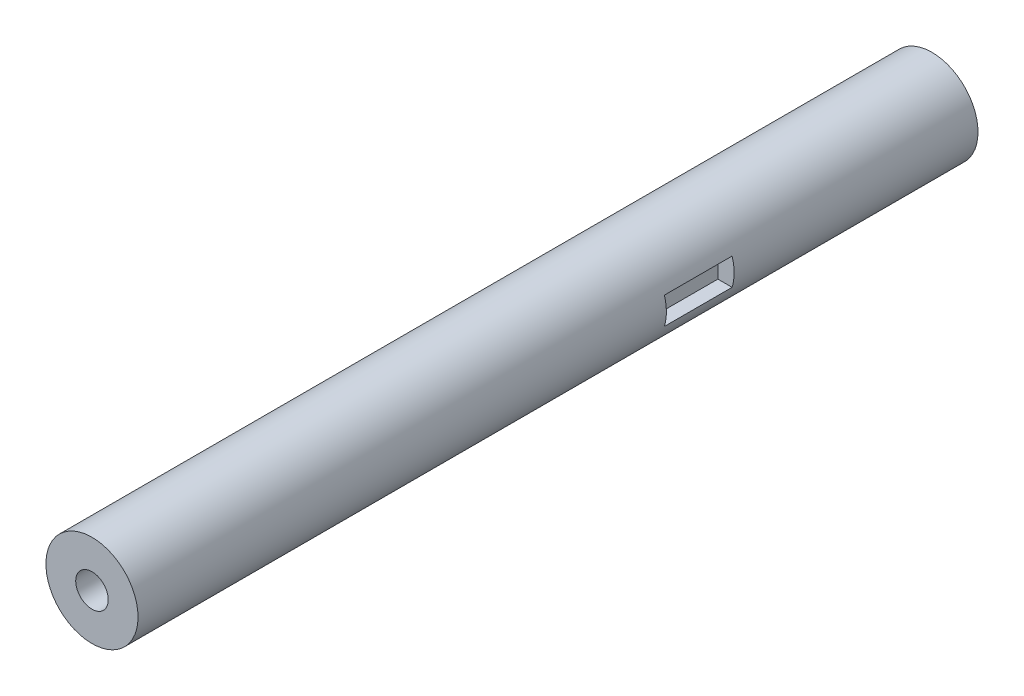
ISO-10303-21;
HEADER;
FILE_DESCRIPTION(('STEP AP214'),'2;1');
FILE_NAME('part.step','',(''),(''),'','','');
FILE_SCHEMA(('AUTOMOTIVE_DESIGN { 1 0 10303 214 1 1 1 1 }'));
ENDSEC;
DATA;
#1=APPLICATION_CONTEXT('core data for automotive mechanical design processes');
#2=APPLICATION_PROTOCOL_DEFINITION('international standard','automotive_design',2000,#1);
#3=PRODUCT_CONTEXT('',#1,'mechanical');
#4=PRODUCT('Part','Part','',(#3));
#5=PRODUCT_RELATED_PRODUCT_CATEGORY('part','',(#4));
#6=PRODUCT_DEFINITION_FORMATION('','',#4);
#7=PRODUCT_DEFINITION_CONTEXT('part definition',#1,'design');
#8=PRODUCT_DEFINITION('design','',#6,#7);
#9=PRODUCT_DEFINITION_SHAPE('','',#8);
#10=(LENGTH_UNIT() NAMED_UNIT(*) SI_UNIT(.MILLI.,.METRE.));
#11=(NAMED_UNIT(*) PLANE_ANGLE_UNIT() SI_UNIT($,.RADIAN.));
#12=(NAMED_UNIT(*) SI_UNIT($,.STERADIAN.) SOLID_ANGLE_UNIT());
#13=UNCERTAINTY_MEASURE_WITH_UNIT(LENGTH_MEASURE(1.E-05),#10,'distance_accuracy_value','');
#14=(GEOMETRIC_REPRESENTATION_CONTEXT(3) GLOBAL_UNCERTAINTY_ASSIGNED_CONTEXT((#13)) GLOBAL_UNIT_ASSIGNED_CONTEXT((#10,
#11,#12)) REPRESENTATION_CONTEXT('',''));
#15=CARTESIAN_POINT('',(0.,0.,0.));
#16=DIRECTION('',(0.,0.,1.));
#17=DIRECTION('',(1.,0.,0.));
#18=AXIS2_PLACEMENT_3D('',#15,#16,#17);
#19=CARTESIAN_POINT('',(0.,0.,80.));
#20=DIRECTION('',(0.,0.,1.));
#21=DIRECTION('',(1.,0.,0.));
#22=AXIS2_PLACEMENT_3D('',#19,#20,#21);
#23=PLANE('',#22);
#24=CARTESIAN_POINT('',(0.,0.,80.));
#25=DIRECTION('',(0.,0.,1.));
#26=DIRECTION('',(1.,0.,0.));
#27=AXIS2_PLACEMENT_3D('',#24,#25,#26);
#28=CIRCLE('',#27,8.5);
#29=CARTESIAN_POINT('',(8.5,0.,80.));
#30=VERTEX_POINT('',#29);
#31=EDGE_CURVE('E121',#30,#30,#28,.T.);
#32=ORIENTED_EDGE('',*,*,#31,.T.);
#33=EDGE_LOOP('',(#32));
#34=FACE_BOUND('',#33,.T.);
#35=CARTESIAN_POINT('',(0.,0.,80.));
#36=DIRECTION('',(0.,0.,1.));
#37=DIRECTION('',(1.,0.,0.));
#38=AXIS2_PLACEMENT_3D('',#35,#36,#37);
#39=CIRCLE('',#38,3.);
#40=CARTESIAN_POINT('',(3.,0.,80.));
#41=VERTEX_POINT('',#40);
#42=EDGE_CURVE('E111',#41,#41,#39,.T.);
#43=ORIENTED_EDGE('',*,*,#42,.F.);
#44=EDGE_LOOP('',(#43));
#45=FACE_BOUND('',#44,.T.);
#46=ADVANCED_FACE('F40',(#34,#45),#23,.T.);
#47=CARTESIAN_POINT('',(0.,0.,-75.));
#48=DIRECTION('',(0.,0.,1.));
#49=DIRECTION('',(1.,0.,0.));
#50=AXIS2_PLACEMENT_3D('',#47,#48,#49);
#51=PLANE('',#50);
#52=CARTESIAN_POINT('',(0.,0.,-75.));
#53=DIRECTION('',(0.,0.,1.));
#54=DIRECTION('',(1.,0.,0.));
#55=AXIS2_PLACEMENT_3D('',#52,#53,#54);
#56=CIRCLE('',#55,8.5);
#57=CARTESIAN_POINT('',(8.5,0.,-75.));
#58=VERTEX_POINT('',#57);
#59=EDGE_CURVE('E119',#58,#58,#56,.T.);
#60=ORIENTED_EDGE('',*,*,#59,.F.);
#61=EDGE_LOOP('',(#60));
#62=FACE_BOUND('',#61,.T.);
#63=CARTESIAN_POINT('',(0.,0.,-75.));
#64=DIRECTION('',(0.,0.,1.));
#65=DIRECTION('',(1.,0.,0.));
#66=AXIS2_PLACEMENT_3D('',#63,#64,#65);
#67=CIRCLE('',#66,3.);
#68=CARTESIAN_POINT('',(3.,0.,-75.));
#69=VERTEX_POINT('',#68);
#70=EDGE_CURVE('E106',#69,#69,#67,.T.);
#71=ORIENTED_EDGE('',*,*,#70,.T.);
#72=EDGE_LOOP('',(#71));
#73=FACE_BOUND('',#72,.T.);
#74=ADVANCED_FACE('F156',(#62,#73),#51,.F.);
#75=CARTESIAN_POINT('',(0.,0.,80.));
#76=DIRECTION('',(0.,0.,-1.));
#77=DIRECTION('',(-1.,0.,0.));
#78=AXIS2_PLACEMENT_3D('',#75,#76,#77);
#79=CYLINDRICAL_SURFACE('',#78,8.5);
#80=DIRECTION('',(0.,0.,-1.));
#81=VECTOR('',#80,1.);
#82=CARTESIAN_POINT('',(8.12403840463596,-2.5,80.));
#83=LINE('',#82,#81);
#84=CARTESIAN_POINT('',(8.12403840463596,-2.5,-17.5));
#85=VERTEX_POINT('',#84);
#86=CARTESIAN_POINT('',(8.12403840463596,-2.5,-30.));
#87=VERTEX_POINT('',#86);
#88=EDGE_CURVE('E49',#85,#87,#83,.T.);
#89=ORIENTED_EDGE('',*,*,#88,.F.);
#90=CARTESIAN_POINT('',(0.,0.,-17.5));
#91=DIRECTION('',(0.,0.,1.));
#92=DIRECTION('',(1.,0.,0.));
#93=AXIS2_PLACEMENT_3D('',#90,#91,#92);
#94=CIRCLE('',#93,8.5);
#95=CARTESIAN_POINT('',(8.12403840463596,2.5,-17.5));
#96=VERTEX_POINT('',#95);
#97=EDGE_CURVE('E11',#85,#96,#94,.T.);
#98=ORIENTED_EDGE('',*,*,#97,.T.);
#99=DIRECTION('',(0.,0.,-1.));
#100=VECTOR('',#99,1.);
#101=CARTESIAN_POINT('',(8.12403840463596,2.5,80.));
#102=LINE('',#101,#100);
#103=CARTESIAN_POINT('',(8.12403840463596,2.5,-30.));
#104=VERTEX_POINT('',#103);
#105=EDGE_CURVE('E64',#104,#96,#102,.F.);
#106=ORIENTED_EDGE('',*,*,#105,.F.);
#107=CARTESIAN_POINT('',(0.,0.,-30.));
#108=DIRECTION('',(0.,0.,1.));
#109=DIRECTION('',(1.,0.,0.));
#110=AXIS2_PLACEMENT_3D('',#107,#108,#109);
#111=CIRCLE('',#110,8.5);
#112=EDGE_CURVE('E125',#87,#104,#111,.T.);
#113=ORIENTED_EDGE('',*,*,#112,.F.);
#114=EDGE_LOOP('',(#89,#98,#106,#113));
#115=FACE_BOUND('',#114,.T.);
#116=ORIENTED_EDGE('',*,*,#31,.F.);
#117=EDGE_LOOP('',(#116));
#118=FACE_BOUND('',#117,.T.);
#119=ORIENTED_EDGE('',*,*,#59,.T.);
#120=EDGE_LOOP('',(#119));
#121=FACE_BOUND('',#120,.T.);
#122=ADVANCED_FACE('F42',(#115,#118,#121),#79,.T.);
#123=CARTESIAN_POINT('',(0.,0.,80.));
#124=DIRECTION('',(0.,0.,-1.));
#125=DIRECTION('',(-1.,0.,0.));
#126=AXIS2_PLACEMENT_3D('',#123,#124,#125);
#127=CYLINDRICAL_SURFACE('',#126,3.);
#128=ORIENTED_EDGE('',*,*,#42,.T.);
#129=EDGE_LOOP('',(#128));
#130=FACE_BOUND('',#129,.T.);
#131=ORIENTED_EDGE('',*,*,#70,.F.);
#132=EDGE_LOOP('',(#131));
#133=FACE_BOUND('',#132,.T.);
#134=ADVANCED_FACE('F152',(#130,#133),#127,.F.);
#135=CARTESIAN_POINT('',(5.5,-2.5,-17.5));
#136=DIRECTION('',(0.,1.,0.));
#137=DIRECTION('',(0.,0.,1.));
#138=AXIS2_PLACEMENT_3D('',#135,#136,#137);
#139=PLANE('',#138);
#140=ORIENTED_EDGE('',*,*,#88,.T.);
#141=DIRECTION('',(1.,0.,0.));
#142=VECTOR('',#141,1.);
#143=CARTESIAN_POINT('',(5.5,-2.5,-30.));
#144=LINE('',#143,#142);
#145=CARTESIAN_POINT('',(5.5,-2.5,-30.));
#146=VERTEX_POINT('',#145);
#147=EDGE_CURVE('E56',#146,#87,#144,.T.);
#148=ORIENTED_EDGE('',*,*,#147,.F.);
#149=DIRECTION('',(0.,0.,-1.));
#150=VECTOR('',#149,1.);
#151=CARTESIAN_POINT('',(5.5,-2.5,-17.5));
#152=LINE('',#151,#150);
#153=CARTESIAN_POINT('',(5.5,-2.5,-17.5));
#154=VERTEX_POINT('',#153);
#155=EDGE_CURVE('E98',#154,#146,#152,.T.);
#156=ORIENTED_EDGE('',*,*,#155,.F.);
#157=DIRECTION('',(1.,0.,0.));
#158=VECTOR('',#157,1.);
#159=CARTESIAN_POINT('',(5.5,-2.5,-17.5));
#160=LINE('',#159,#158);
#161=EDGE_CURVE('E83',#154,#85,#160,.T.);
#162=ORIENTED_EDGE('',*,*,#161,.T.);
#163=EDGE_LOOP('',(#140,#148,#156,#162));
#164=FACE_BOUND('',#163,.T.);
#165=ADVANCED_FACE('F104',(#164),#139,.T.);
#166=CARTESIAN_POINT('',(10.5,2.5,-17.5));
#167=DIRECTION('',(0.,-1.,0.));
#168=DIRECTION('',(0.,0.,-1.));
#169=AXIS2_PLACEMENT_3D('',#166,#167,#168);
#170=PLANE('',#169);
#171=ORIENTED_EDGE('',*,*,#105,.T.);
#172=DIRECTION('',(-1.,0.,0.));
#173=VECTOR('',#172,1.);
#174=CARTESIAN_POINT('',(10.5,2.5,-17.5));
#175=LINE('',#174,#173);
#176=CARTESIAN_POINT('',(5.5,2.5,-17.5));
#177=VERTEX_POINT('',#176);
#178=EDGE_CURVE('E91',#96,#177,#175,.T.);
#179=ORIENTED_EDGE('',*,*,#178,.T.);
#180=DIRECTION('',(0.,0.,-1.));
#181=VECTOR('',#180,1.);
#182=CARTESIAN_POINT('',(5.5,2.5,-17.5));
#183=LINE('',#182,#181);
#184=CARTESIAN_POINT('',(5.5,2.5,-30.));
#185=VERTEX_POINT('',#184);
#186=EDGE_CURVE('E100',#177,#185,#183,.T.);
#187=ORIENTED_EDGE('',*,*,#186,.T.);
#188=DIRECTION('',(-1.,0.,0.));
#189=VECTOR('',#188,1.);
#190=CARTESIAN_POINT('',(10.5,2.5,-30.));
#191=LINE('',#190,#189);
#192=EDGE_CURVE('E102',#104,#185,#191,.T.);
#193=ORIENTED_EDGE('',*,*,#192,.F.);
#194=EDGE_LOOP('',(#171,#179,#187,#193));
#195=FACE_BOUND('',#194,.T.);
#196=ADVANCED_FACE('F137',(#195),#170,.T.);
#197=CARTESIAN_POINT('',(0.,0.,-17.5));
#198=DIRECTION('',(0.,0.,1.));
#199=DIRECTION('',(1.,0.,0.));
#200=AXIS2_PLACEMENT_3D('',#197,#198,#199);
#201=PLANE('',#200);
#202=ORIENTED_EDGE('',*,*,#161,.F.);
#203=DIRECTION('',(0.,-1.,0.));
#204=VECTOR('',#203,1.);
#205=CARTESIAN_POINT('',(5.5,2.5,-17.5));
#206=LINE('',#205,#204);
#207=EDGE_CURVE('E86',#177,#154,#206,.T.);
#208=ORIENTED_EDGE('',*,*,#207,.F.);
#209=ORIENTED_EDGE('',*,*,#178,.F.);
#210=ORIENTED_EDGE('',*,*,#97,.F.);
#211=EDGE_LOOP('',(#202,#208,#209,#210));
#212=FACE_BOUND('',#211,.T.);
#213=ADVANCED_FACE('F85',(#212),#201,.F.);
#214=CARTESIAN_POINT('',(0.,0.,-30.));
#215=DIRECTION('',(0.,0.,1.));
#216=DIRECTION('',(1.,0.,0.));
#217=AXIS2_PLACEMENT_3D('',#214,#215,#216);
#218=PLANE('',#217);
#219=ORIENTED_EDGE('',*,*,#112,.T.);
#220=ORIENTED_EDGE('',*,*,#192,.T.);
#221=DIRECTION('',(0.,-1.,0.));
#222=VECTOR('',#221,1.);
#223=CARTESIAN_POINT('',(5.5,2.5,-30.));
#224=LINE('',#223,#222);
#225=EDGE_CURVE('E139',#185,#146,#224,.T.);
#226=ORIENTED_EDGE('',*,*,#225,.T.);
#227=ORIENTED_EDGE('',*,*,#147,.T.);
#228=EDGE_LOOP('',(#219,#220,#226,#227));
#229=FACE_BOUND('',#228,.T.);
#230=ADVANCED_FACE('F136',(#229),#218,.T.);
#231=CARTESIAN_POINT('',(5.5,2.5,-17.5));
#232=DIRECTION('',(1.,0.,0.));
#233=DIRECTION('',(0.,0.,-1.));
#234=AXIS2_PLACEMENT_3D('',#231,#232,#233);
#235=PLANE('',#234);
#236=ORIENTED_EDGE('',*,*,#225,.F.);
#237=ORIENTED_EDGE('',*,*,#186,.F.);
#238=ORIENTED_EDGE('',*,*,#207,.T.);
#239=ORIENTED_EDGE('',*,*,#155,.T.);
#240=EDGE_LOOP('',(#236,#237,#238,#239));
#241=FACE_BOUND('',#240,.T.);
#242=ADVANCED_FACE('F97',(#241),#235,.T.);
#243=CLOSED_SHELL('',(#46,#74,#122,#134,#165,#196,#213,#230,#242));
#244=MANIFOLD_SOLID_BREP('B2',#243);
#245=ADVANCED_BREP_SHAPE_REPRESENTATION('',(#18,#244),#14);
#246=SHAPE_DEFINITION_REPRESENTATION(#9,#245);
ENDSEC;
END-ISO-10303-21;
